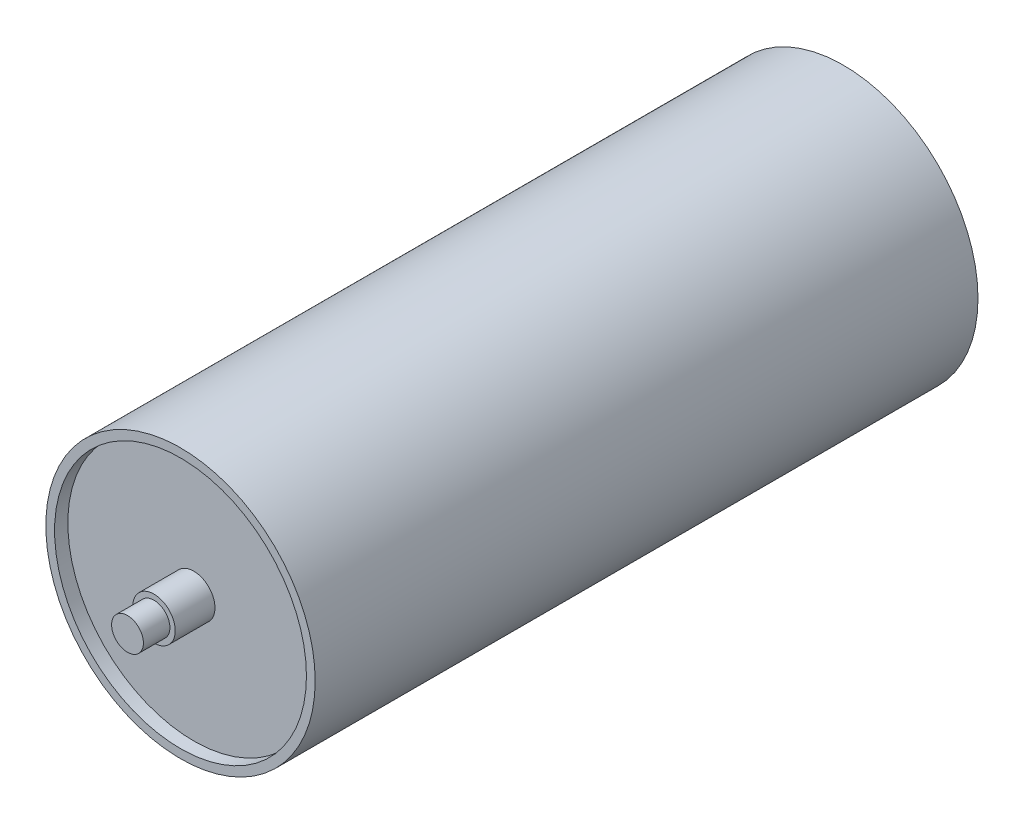
ISO-10303-21;
HEADER;
FILE_DESCRIPTION(('STEP AP214'),'2;1');
FILE_NAME('part.step','',(''),(''),'','','');
FILE_SCHEMA(('AUTOMOTIVE_DESIGN { 1 0 10303 214 1 1 1 1 }'));
ENDSEC;
DATA;
#1=APPLICATION_CONTEXT('core data for automotive mechanical design processes');
#2=APPLICATION_PROTOCOL_DEFINITION('international standard','automotive_design',2000,#1);
#3=PRODUCT_CONTEXT('',#1,'mechanical');
#4=PRODUCT('Part','Part','',(#3));
#5=PRODUCT_RELATED_PRODUCT_CATEGORY('part','',(#4));
#6=PRODUCT_DEFINITION_FORMATION('','',#4);
#7=PRODUCT_DEFINITION_CONTEXT('part definition',#1,'design');
#8=PRODUCT_DEFINITION('design','',#6,#7);
#9=PRODUCT_DEFINITION_SHAPE('','',#8);
#10=(LENGTH_UNIT() NAMED_UNIT(*) SI_UNIT(.MILLI.,.METRE.));
#11=(NAMED_UNIT(*) PLANE_ANGLE_UNIT() SI_UNIT($,.RADIAN.));
#12=(NAMED_UNIT(*) SI_UNIT($,.STERADIAN.) SOLID_ANGLE_UNIT());
#13=UNCERTAINTY_MEASURE_WITH_UNIT(LENGTH_MEASURE(1.E-05),#10,'distance_accuracy_value','');
#14=(GEOMETRIC_REPRESENTATION_CONTEXT(3) GLOBAL_UNCERTAINTY_ASSIGNED_CONTEXT((#13)) GLOBAL_UNIT_ASSIGNED_CONTEXT((#10,
#11,#12)) REPRESENTATION_CONTEXT('',''));
#15=CARTESIAN_POINT('',(0.,0.,0.));
#16=DIRECTION('',(0.,0.,1.));
#17=DIRECTION('',(1.,0.,0.));
#18=AXIS2_PLACEMENT_3D('',#15,#16,#17);
#19=CARTESIAN_POINT('',(0.,0.,250.));
#20=DIRECTION('',(0.,0.,-1.));
#21=DIRECTION('',(-1.,0.,0.));
#22=AXIS2_PLACEMENT_3D('',#19,#20,#21);
#23=CYLINDRICAL_SURFACE('',#22,50.8);
#24=CARTESIAN_POINT('',(0.,0.,250.));
#25=DIRECTION('',(0.,0.,1.));
#26=DIRECTION('',(1.,0.,0.));
#27=AXIS2_PLACEMENT_3D('',#24,#25,#26);
#28=CIRCLE('',#27,50.8);
#29=CARTESIAN_POINT('',(50.8,0.,250.));
#30=VERTEX_POINT('',#29);
#31=EDGE_CURVE('E50',#30,#30,#28,.T.);
#32=ORIENTED_EDGE('',*,*,#31,.F.);
#33=EDGE_LOOP('',(#32));
#34=FACE_BOUND('',#33,.T.);
#35=CARTESIAN_POINT('',(0.,0.,0.));
#36=DIRECTION('',(0.,0.,1.));
#37=DIRECTION('',(1.,0.,0.));
#38=AXIS2_PLACEMENT_3D('',#35,#36,#37);
#39=CIRCLE('',#38,50.8);
#40=CARTESIAN_POINT('',(50.8,0.,0.));
#41=VERTEX_POINT('',#40);
#42=EDGE_CURVE('E41',#41,#41,#39,.T.);
#43=ORIENTED_EDGE('',*,*,#42,.T.);
#44=EDGE_LOOP('',(#43));
#45=FACE_BOUND('',#44,.T.);
#46=ADVANCED_FACE('F38',(#34,#45),#23,.T.);
#47=CARTESIAN_POINT('',(0.,0.,250.));
#48=DIRECTION('',(0.,0.,1.));
#49=DIRECTION('',(1.,0.,0.));
#50=AXIS2_PLACEMENT_3D('',#47,#48,#49);
#51=PLANE('',#50);
#52=CARTESIAN_POINT('',(0.,0.,250.));
#53=DIRECTION('',(0.,0.,1.));
#54=DIRECTION('',(1.,0.,0.));
#55=AXIS2_PLACEMENT_3D('',#52,#53,#54);
#56=CIRCLE('',#55,47.5);
#57=CARTESIAN_POINT('',(47.5,0.,250.));
#58=VERTEX_POINT('',#57);
#59=EDGE_CURVE('E74',#58,#58,#56,.T.);
#60=ORIENTED_EDGE('',*,*,#59,.F.);
#61=EDGE_LOOP('',(#60));
#62=FACE_BOUND('',#61,.T.);
#63=ORIENTED_EDGE('',*,*,#31,.T.);
#64=EDGE_LOOP('',(#63));
#65=FACE_BOUND('',#64,.T.);
#66=ADVANCED_FACE('F91',(#62,#65),#51,.T.);
#67=CARTESIAN_POINT('',(0.,0.,0.));
#68=DIRECTION('',(0.,0.,1.));
#69=DIRECTION('',(1.,0.,0.));
#70=AXIS2_PLACEMENT_3D('',#67,#68,#69);
#71=PLANE('',#70);
#72=CARTESIAN_POINT('',(0.,0.,0.));
#73=DIRECTION('',(0.,0.,-1.));
#74=DIRECTION('',(-1.,0.,0.));
#75=AXIS2_PLACEMENT_3D('',#72,#73,#74);
#76=CIRCLE('',#75,47.5);
#77=CARTESIAN_POINT('',(-47.5,0.,0.));
#78=VERTEX_POINT('',#77);
#79=EDGE_CURVE('E68',#78,#78,#76,.T.);
#80=ORIENTED_EDGE('',*,*,#79,.F.);
#81=EDGE_LOOP('',(#80));
#82=FACE_BOUND('',#81,.T.);
#83=ORIENTED_EDGE('',*,*,#42,.F.);
#84=EDGE_LOOP('',(#83));
#85=FACE_BOUND('',#84,.T.);
#86=ADVANCED_FACE('F88',(#82,#85),#71,.F.);
#87=CARTESIAN_POINT('',(0.,0.,245.));
#88=DIRECTION('',(0.,0.,1.));
#89=DIRECTION('',(1.,0.,0.));
#90=AXIS2_PLACEMENT_3D('',#87,#88,#89);
#91=CYLINDRICAL_SURFACE('',#90,47.5);
#92=CARTESIAN_POINT('',(0.,0.,245.));
#93=DIRECTION('',(0.,0.,1.));
#94=DIRECTION('',(1.,0.,0.));
#95=AXIS2_PLACEMENT_3D('',#92,#93,#94);
#96=CIRCLE('',#95,47.5);
#97=CARTESIAN_POINT('',(47.5,0.,245.));
#98=VERTEX_POINT('',#97);
#99=EDGE_CURVE('E77',#98,#98,#96,.T.);
#100=ORIENTED_EDGE('',*,*,#99,.F.);
#101=EDGE_LOOP('',(#100));
#102=FACE_BOUND('',#101,.T.);
#103=ORIENTED_EDGE('',*,*,#59,.T.);
#104=EDGE_LOOP('',(#103));
#105=FACE_BOUND('',#104,.T.);
#106=ADVANCED_FACE('F90',(#102,#105),#91,.F.);
#107=CARTESIAN_POINT('',(0.,0.,245.));
#108=DIRECTION('',(0.,0.,1.));
#109=DIRECTION('',(1.,0.,0.));
#110=AXIS2_PLACEMENT_3D('',#107,#108,#109);
#111=PLANE('',#110);
#112=CARTESIAN_POINT('',(0.,0.,245.));
#113=DIRECTION('',(0.,0.,1.));
#114=DIRECTION('',(1.,0.,0.));
#115=AXIS2_PLACEMENT_3D('',#112,#113,#114);
#116=CIRCLE('',#115,8.);
#117=CARTESIAN_POINT('',(8.,0.,245.));
#118=VERTEX_POINT('',#117);
#119=EDGE_CURVE('E57',#118,#118,#116,.T.);
#120=ORIENTED_EDGE('',*,*,#119,.F.);
#121=EDGE_LOOP('',(#120));
#122=FACE_BOUND('',#121,.T.);
#123=ORIENTED_EDGE('',*,*,#99,.T.);
#124=EDGE_LOOP('',(#123));
#125=FACE_BOUND('',#124,.T.);
#126=ADVANCED_FACE('F97',(#122,#125),#111,.T.);
#127=CARTESIAN_POINT('',(0.,0.,5.));
#128=DIRECTION('',(0.,0.,-1.));
#129=DIRECTION('',(-1.,0.,0.));
#130=AXIS2_PLACEMENT_3D('',#127,#128,#129);
#131=CYLINDRICAL_SURFACE('',#130,47.5);
#132=CARTESIAN_POINT('',(0.,0.,5.));
#133=DIRECTION('',(0.,0.,-1.));
#134=DIRECTION('',(-1.,0.,0.));
#135=AXIS2_PLACEMENT_3D('',#132,#133,#134);
#136=CIRCLE('',#135,47.5);
#137=CARTESIAN_POINT('',(-47.5,0.,5.));
#138=VERTEX_POINT('',#137);
#139=EDGE_CURVE('E71',#138,#138,#136,.T.);
#140=ORIENTED_EDGE('',*,*,#139,.F.);
#141=EDGE_LOOP('',(#140));
#142=FACE_BOUND('',#141,.T.);
#143=ORIENTED_EDGE('',*,*,#79,.T.);
#144=EDGE_LOOP('',(#143));
#145=FACE_BOUND('',#144,.T.);
#146=ADVANCED_FACE('F131',(#142,#145),#131,.F.);
#147=CARTESIAN_POINT('',(0.,0.,5.));
#148=DIRECTION('',(0.,0.,-1.));
#149=DIRECTION('',(-1.,0.,0.));
#150=AXIS2_PLACEMENT_3D('',#147,#148,#149);
#151=PLANE('',#150);
#152=CARTESIAN_POINT('',(0.,0.,5.));
#153=DIRECTION('',(0.,0.,-1.));
#154=DIRECTION('',(-1.,0.,0.));
#155=AXIS2_PLACEMENT_3D('',#152,#153,#154);
#156=CIRCLE('',#155,8.);
#157=CARTESIAN_POINT('',(-8.,0.,5.));
#158=VERTEX_POINT('',#157);
#159=EDGE_CURVE('E62',#158,#158,#156,.T.);
#160=ORIENTED_EDGE('',*,*,#159,.F.);
#161=EDGE_LOOP('',(#160));
#162=FACE_BOUND('',#161,.T.);
#163=ORIENTED_EDGE('',*,*,#139,.T.);
#164=EDGE_LOOP('',(#163));
#165=FACE_BOUND('',#164,.T.);
#166=ADVANCED_FACE('F136',(#162,#165),#151,.T.);
#167=CARTESIAN_POINT('',(0.,0.,-10.));
#168=DIRECTION('',(0.,0.,1.));
#169=DIRECTION('',(1.,0.,0.));
#170=AXIS2_PLACEMENT_3D('',#167,#168,#169);
#171=CYLINDRICAL_SURFACE('',#170,8.);
#172=CARTESIAN_POINT('',(0.,0.,-10.));
#173=DIRECTION('',(0.,0.,-1.));
#174=DIRECTION('',(-1.,0.,0.));
#175=AXIS2_PLACEMENT_3D('',#172,#173,#174);
#176=CIRCLE('',#175,8.);
#177=CARTESIAN_POINT('',(-8.,0.,-10.));
#178=VERTEX_POINT('',#177);
#179=EDGE_CURVE('E65',#178,#178,#176,.T.);
#180=ORIENTED_EDGE('',*,*,#179,.F.);
#181=EDGE_LOOP('',(#180));
#182=FACE_BOUND('',#181,.T.);
#183=ORIENTED_EDGE('',*,*,#159,.T.);
#184=EDGE_LOOP('',(#183));
#185=FACE_BOUND('',#184,.T.);
#186=ADVANCED_FACE('F147',(#182,#185),#171,.T.);
#187=CARTESIAN_POINT('',(0.,0.,-10.));
#188=DIRECTION('',(0.,0.,-1.));
#189=DIRECTION('',(-1.,0.,0.));
#190=AXIS2_PLACEMENT_3D('',#187,#188,#189);
#191=PLANE('',#190);
#192=CARTESIAN_POINT('',(0.,0.,-10.));
#193=DIRECTION('',(0.,0.,-1.));
#194=DIRECTION('',(-1.,0.,0.));
#195=AXIS2_PLACEMENT_3D('',#192,#193,#194);
#196=CIRCLE('',#195,6.);
#197=CARTESIAN_POINT('',(-6.,0.,-10.));
#198=VERTEX_POINT('',#197);
#199=EDGE_CURVE('E45',#198,#198,#196,.T.);
#200=ORIENTED_EDGE('',*,*,#199,.F.);
#201=EDGE_LOOP('',(#200));
#202=FACE_BOUND('',#201,.T.);
#203=ORIENTED_EDGE('',*,*,#179,.T.);
#204=EDGE_LOOP('',(#203));
#205=FACE_BOUND('',#204,.T.);
#206=ADVANCED_FACE('F158',(#202,#205),#191,.T.);
#207=CARTESIAN_POINT('',(0.,0.,260.));
#208=DIRECTION('',(0.,0.,-1.));
#209=DIRECTION('',(-1.,0.,0.));
#210=AXIS2_PLACEMENT_3D('',#207,#208,#209);
#211=CYLINDRICAL_SURFACE('',#210,8.);
#212=CARTESIAN_POINT('',(0.,0.,260.));
#213=DIRECTION('',(0.,0.,1.));
#214=DIRECTION('',(1.,0.,0.));
#215=AXIS2_PLACEMENT_3D('',#212,#213,#214);
#216=CIRCLE('',#215,8.);
#217=CARTESIAN_POINT('',(8.,0.,260.));
#218=VERTEX_POINT('',#217);
#219=EDGE_CURVE('E59',#218,#218,#216,.T.);
#220=ORIENTED_EDGE('',*,*,#219,.F.);
#221=EDGE_LOOP('',(#220));
#222=FACE_BOUND('',#221,.T.);
#223=ORIENTED_EDGE('',*,*,#119,.T.);
#224=EDGE_LOOP('',(#223));
#225=FACE_BOUND('',#224,.T.);
#226=ADVANCED_FACE('F175',(#222,#225),#211,.T.);
#227=CARTESIAN_POINT('',(0.,0.,260.));
#228=DIRECTION('',(0.,0.,1.));
#229=DIRECTION('',(1.,0.,0.));
#230=AXIS2_PLACEMENT_3D('',#227,#228,#229);
#231=PLANE('',#230);
#232=CARTESIAN_POINT('',(0.,0.,260.));
#233=DIRECTION('',(0.,0.,1.));
#234=DIRECTION('',(1.,0.,0.));
#235=AXIS2_PLACEMENT_3D('',#232,#233,#234);
#236=CIRCLE('',#235,6.);
#237=CARTESIAN_POINT('',(6.,0.,260.));
#238=VERTEX_POINT('',#237);
#239=EDGE_CURVE('E10',#238,#238,#236,.T.);
#240=ORIENTED_EDGE('',*,*,#239,.F.);
#241=EDGE_LOOP('',(#240));
#242=FACE_BOUND('',#241,.T.);
#243=ORIENTED_EDGE('',*,*,#219,.T.);
#244=EDGE_LOOP('',(#243));
#245=FACE_BOUND('',#244,.T.);
#246=ADVANCED_FACE('F180',(#242,#245),#231,.T.);
#247=CARTESIAN_POINT('',(0.,0.,-20.));
#248=DIRECTION('',(0.,0.,1.));
#249=DIRECTION('',(1.,0.,0.));
#250=AXIS2_PLACEMENT_3D('',#247,#248,#249);
#251=CYLINDRICAL_SURFACE('',#250,6.);
#252=CARTESIAN_POINT('',(0.,0.,-20.));
#253=DIRECTION('',(0.,0.,-1.));
#254=DIRECTION('',(-1.,0.,0.));
#255=AXIS2_PLACEMENT_3D('',#252,#253,#254);
#256=CIRCLE('',#255,6.);
#257=CARTESIAN_POINT('',(-6.,0.,-20.));
#258=VERTEX_POINT('',#257);
#259=EDGE_CURVE('E55',#258,#258,#256,.T.);
#260=ORIENTED_EDGE('',*,*,#259,.F.);
#261=EDGE_LOOP('',(#260));
#262=FACE_BOUND('',#261,.T.);
#263=ORIENTED_EDGE('',*,*,#199,.T.);
#264=EDGE_LOOP('',(#263));
#265=FACE_BOUND('',#264,.T.);
#266=ADVANCED_FACE('F197',(#262,#265),#251,.T.);
#267=CARTESIAN_POINT('',(0.,0.,-20.));
#268=DIRECTION('',(0.,0.,-1.));
#269=DIRECTION('',(-1.,0.,0.));
#270=AXIS2_PLACEMENT_3D('',#267,#268,#269);
#271=PLANE('',#270);
#272=ORIENTED_EDGE('',*,*,#259,.T.);
#273=EDGE_LOOP('',(#272));
#274=FACE_BOUND('',#273,.T.);
#275=ADVANCED_FACE('F202',(#274),#271,.T.);
#276=CARTESIAN_POINT('',(0.,0.,270.));
#277=DIRECTION('',(0.,0.,-1.));
#278=DIRECTION('',(-1.,0.,0.));
#279=AXIS2_PLACEMENT_3D('',#276,#277,#278);
#280=CYLINDRICAL_SURFACE('',#279,6.);
#281=CARTESIAN_POINT('',(0.,0.,270.));
#282=DIRECTION('',(0.,0.,1.));
#283=DIRECTION('',(1.,0.,0.));
#284=AXIS2_PLACEMENT_3D('',#281,#282,#283);
#285=CIRCLE('',#284,6.);
#286=CARTESIAN_POINT('',(6.,0.,270.));
#287=VERTEX_POINT('',#286);
#288=EDGE_CURVE('E54',#287,#287,#285,.T.);
#289=ORIENTED_EDGE('',*,*,#288,.F.);
#290=EDGE_LOOP('',(#289));
#291=FACE_BOUND('',#290,.T.);
#292=ORIENTED_EDGE('',*,*,#239,.T.);
#293=EDGE_LOOP('',(#292));
#294=FACE_BOUND('',#293,.T.);
#295=ADVANCED_FACE('F213',(#291,#294),#280,.T.);
#296=CARTESIAN_POINT('',(0.,0.,270.));
#297=DIRECTION('',(0.,0.,1.));
#298=DIRECTION('',(1.,0.,0.));
#299=AXIS2_PLACEMENT_3D('',#296,#297,#298);
#300=PLANE('',#299);
#301=ORIENTED_EDGE('',*,*,#288,.T.);
#302=EDGE_LOOP('',(#301));
#303=FACE_BOUND('',#302,.T.);
#304=ADVANCED_FACE('F232',(#303),#300,.T.);
#305=CLOSED_SHELL('',(#46,#66,#86,#106,#126,#146,#166,#186,#206,#226,#246,#266,#275,#295,#304));
#306=MANIFOLD_SOLID_BREP('B2',#305);
#307=ADVANCED_BREP_SHAPE_REPRESENTATION('',(#18,#306),#14);
#308=SHAPE_DEFINITION_REPRESENTATION(#9,#307);
ENDSEC;
END-ISO-10303-21;
